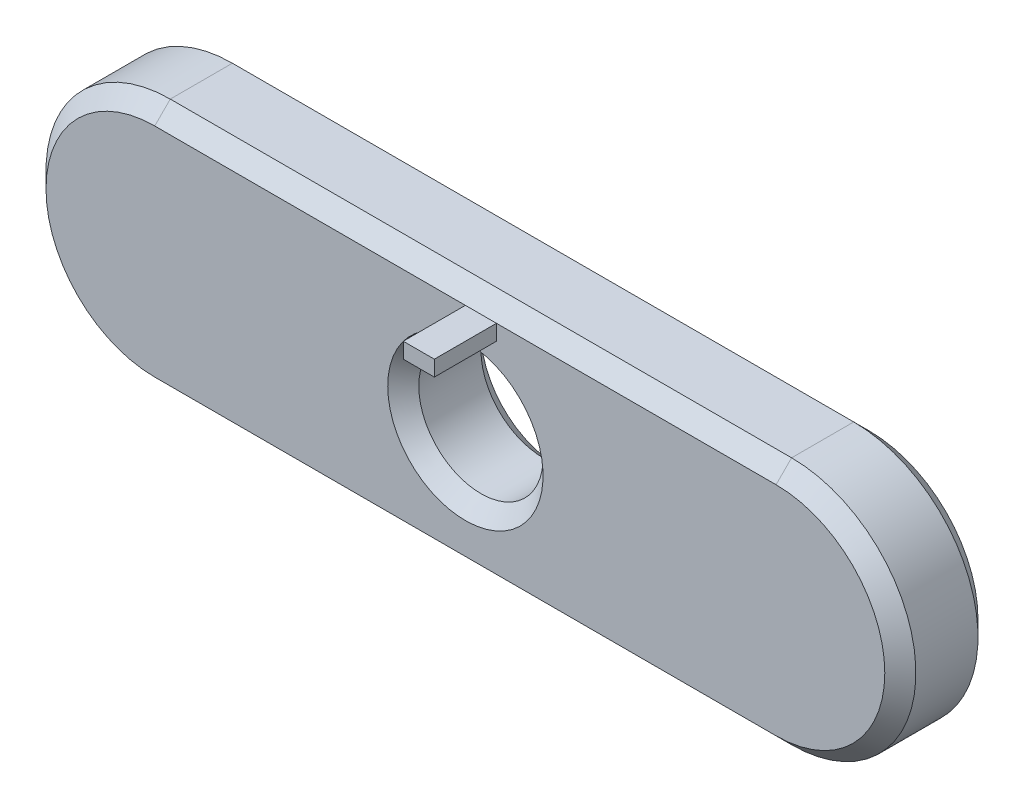
ISO-10303-21;
HEADER;
FILE_DESCRIPTION(('STEP AP214'),'2;1');
FILE_NAME('part.step','',(''),(''),'','','');
FILE_SCHEMA(('AUTOMOTIVE_DESIGN { 1 0 10303 214 1 1 1 1 }'));
ENDSEC;
DATA;
#1=APPLICATION_CONTEXT('core data for automotive mechanical design processes');
#2=APPLICATION_PROTOCOL_DEFINITION('international standard','automotive_design',2000,#1);
#3=PRODUCT_CONTEXT('',#1,'mechanical');
#4=PRODUCT('Part','Part','',(#3));
#5=PRODUCT_RELATED_PRODUCT_CATEGORY('part','',(#4));
#6=PRODUCT_DEFINITION_FORMATION('','',#4);
#7=PRODUCT_DEFINITION_CONTEXT('part definition',#1,'design');
#8=PRODUCT_DEFINITION('design','',#6,#7);
#9=PRODUCT_DEFINITION_SHAPE('','',#8);
#10=(LENGTH_UNIT() NAMED_UNIT(*) SI_UNIT(.MILLI.,.METRE.));
#11=(NAMED_UNIT(*) PLANE_ANGLE_UNIT() SI_UNIT($,.RADIAN.));
#12=(NAMED_UNIT(*) SI_UNIT($,.STERADIAN.) SOLID_ANGLE_UNIT());
#13=UNCERTAINTY_MEASURE_WITH_UNIT(LENGTH_MEASURE(1.E-05),#10,'distance_accuracy_value','');
#14=(GEOMETRIC_REPRESENTATION_CONTEXT(3) GLOBAL_UNCERTAINTY_ASSIGNED_CONTEXT((#13)) GLOBAL_UNIT_ASSIGNED_CONTEXT((#10,
#11,#12)) REPRESENTATION_CONTEXT('',''));
#15=CARTESIAN_POINT('',(0.,0.,0.));
#16=DIRECTION('',(0.,0.,1.));
#17=DIRECTION('',(1.,0.,0.));
#18=AXIS2_PLACEMENT_3D('',#15,#16,#17);
#19=CARTESIAN_POINT('',(10.,0.,3.));
#20=DIRECTION('',(0.,0.,-1.));
#21=DIRECTION('',(-1.,0.,0.));
#22=AXIS2_PLACEMENT_3D('',#19,#20,#21);
#23=PLANE('',#22);
#24=CARTESIAN_POINT('',(0.,0.,3.));
#25=DIRECTION('',(0.,0.,-1.));
#26=DIRECTION('',(-1.,0.,0.));
#27=AXIS2_PLACEMENT_3D('',#24,#25,#26);
#28=CIRCLE('',#27,2.5);
#29=CARTESIAN_POINT('',(-2.5,0.,3.));
#30=VERTEX_POINT('',#29);
#31=EDGE_CURVE('E183',#30,#30,#28,.T.);
#32=ORIENTED_EDGE('',*,*,#31,.T.);
#33=EDGE_LOOP('',(#32));
#34=FACE_BOUND('',#33,.T.);
#35=DIRECTION('',(0.,-1.,0.));
#36=VECTOR('',#35,1.);
#37=CARTESIAN_POINT('',(0.,0.,3.));
#38=LINE('',#37,#36);
#39=CARTESIAN_POINT('',(0.,3.49999999999997,3.00000000000002));
#40=VERTEX_POINT('',#39);
#41=CARTESIAN_POINT('',(0.,3.,3.));
#42=VERTEX_POINT('',#41);
#43=EDGE_CURVE('E147',#40,#42,#38,.T.);
#44=ORIENTED_EDGE('',*,*,#43,.F.);
#45=DIRECTION('',(-1.,0.,0.));
#46=VECTOR('',#45,1.);
#47=CARTESIAN_POINT('',(-10.,3.5,3.));
#48=LINE('',#47,#46);
#49=CARTESIAN_POINT('',(-10.,3.5,3.));
#50=VERTEX_POINT('',#49);
#51=EDGE_CURVE('E196',#40,#50,#48,.T.);
#52=ORIENTED_EDGE('',*,*,#51,.T.);
#53=CARTESIAN_POINT('',(-10.,0.,3.));
#54=DIRECTION('',(0.,0.,-1.));
#55=DIRECTION('',(-1.,0.,0.));
#56=AXIS2_PLACEMENT_3D('',#53,#54,#55);
#57=CIRCLE('',#56,3.49999999999999);
#58=CARTESIAN_POINT('',(-10.,-3.49999999999999,3.));
#59=VERTEX_POINT('',#58);
#60=EDGE_CURVE('E199',#50,#59,#57,.F.);
#61=ORIENTED_EDGE('',*,*,#60,.T.);
#62=DIRECTION('',(1.,0.,0.));
#63=VECTOR('',#62,1.);
#64=CARTESIAN_POINT('',(10.,-3.49999999999999,3.));
#65=LINE('',#64,#63);
#66=CARTESIAN_POINT('',(10.,-3.5,3.));
#67=VERTEX_POINT('',#66);
#68=EDGE_CURVE('E201',#59,#67,#65,.T.);
#69=ORIENTED_EDGE('',*,*,#68,.T.);
#70=CARTESIAN_POINT('',(10.,0.,3.));
#71=DIRECTION('',(0.,0.,-1.));
#72=DIRECTION('',(-1.,0.,0.));
#73=AXIS2_PLACEMENT_3D('',#70,#71,#72);
#74=CIRCLE('',#73,3.5);
#75=CARTESIAN_POINT('',(10.,3.5,3.));
#76=VERTEX_POINT('',#75);
#77=EDGE_CURVE('E194',#67,#76,#74,.F.);
#78=ORIENTED_EDGE('',*,*,#77,.T.);
#79=CARTESIAN_POINT('',(1.,3.5,3.));
#80=VERTEX_POINT('',#79);
#81=EDGE_CURVE('E197',#76,#80,#48,.T.);
#82=ORIENTED_EDGE('',*,*,#81,.T.);
#83=DIRECTION('',(0.,1.,0.));
#84=VECTOR('',#83,1.);
#85=CARTESIAN_POINT('',(1.,0.,3.));
#86=LINE('',#85,#84);
#87=CARTESIAN_POINT('',(1.,3.,3.));
#88=VERTEX_POINT('',#87);
#89=EDGE_CURVE('E56',#88,#80,#86,.T.);
#90=ORIENTED_EDGE('',*,*,#89,.F.);
#91=DIRECTION('',(1.,0.,0.));
#92=VECTOR('',#91,1.);
#93=CARTESIAN_POINT('',(10.,3.,3.));
#94=LINE('',#93,#92);
#95=EDGE_CURVE('E51',#42,#88,#94,.T.);
#96=ORIENTED_EDGE('',*,*,#95,.F.);
#97=EDGE_LOOP('',(#44,#52,#61,#69,#78,#82,#90,#96));
#98=FACE_BOUND('',#97,.T.);
#99=ADVANCED_FACE('F36',(#34,#98),#23,.F.);
#100=CARTESIAN_POINT('',(10.,0.,3.));
#101=DIRECTION('',(0.,0.,-1.));
#102=DIRECTION('',(-1.,0.,0.));
#103=AXIS2_PLACEMENT_3D('',#100,#101,#102);
#104=CYLINDRICAL_SURFACE('',#103,4.);
#105=DIRECTION('',(0.,0.,-1.));
#106=VECTOR('',#105,1.);
#107=CARTESIAN_POINT('',(10.,4.,3.));
#108=LINE('',#107,#106);
#109=CARTESIAN_POINT('',(10.,4.,2.49999999999999));
#110=VERTEX_POINT('',#109);
#111=CARTESIAN_POINT('',(10.,4.,0.500000000000003));
#112=VERTEX_POINT('',#111);
#113=EDGE_CURVE('E180',#110,#112,#108,.T.);
#114=ORIENTED_EDGE('',*,*,#113,.F.);
#115=CARTESIAN_POINT('',(10.,0.,2.49999999999999));
#116=DIRECTION('',(0.,0.,-1.));
#117=DIRECTION('',(-1.,0.,0.));
#118=AXIS2_PLACEMENT_3D('',#115,#116,#117);
#119=CIRCLE('',#118,4.);
#120=CARTESIAN_POINT('',(10.,-4.,2.49999999999999));
#121=VERTEX_POINT('',#120);
#122=EDGE_CURVE('E220',#110,#121,#119,.T.);
#123=ORIENTED_EDGE('',*,*,#122,.T.);
#124=DIRECTION('',(0.,0.,-1.));
#125=VECTOR('',#124,1.);
#126=CARTESIAN_POINT('',(10.,-4.,3.));
#127=LINE('',#126,#125);
#128=CARTESIAN_POINT('',(10.,-4.,0.500000000000003));
#129=VERTEX_POINT('',#128);
#130=EDGE_CURVE('E179',#121,#129,#127,.T.);
#131=ORIENTED_EDGE('',*,*,#130,.T.);
#132=CARTESIAN_POINT('',(10.,0.,0.500000000000003));
#133=DIRECTION('',(0.,0.,-1.));
#134=DIRECTION('',(-1.,0.,0.));
#135=AXIS2_PLACEMENT_3D('',#132,#133,#134);
#136=CIRCLE('',#135,4.);
#137=EDGE_CURVE('E218',#129,#112,#136,.F.);
#138=ORIENTED_EDGE('',*,*,#137,.T.);
#139=EDGE_LOOP('',(#114,#123,#131,#138));
#140=FACE_BOUND('',#139,.T.);
#141=ADVANCED_FACE('F38',(#140),#104,.T.);
#142=CARTESIAN_POINT('',(-10.,4.,3.));
#143=DIRECTION('',(0.,1.,0.));
#144=DIRECTION('',(0.,0.,1.));
#145=AXIS2_PLACEMENT_3D('',#142,#143,#144);
#146=PLANE('',#145);
#147=DIRECTION('',(0.,0.,-1.));
#148=VECTOR('',#147,1.);
#149=CARTESIAN_POINT('',(-10.,4.,3.));
#150=LINE('',#149,#148);
#151=CARTESIAN_POINT('',(-10.,4.,2.49999999999999));
#152=VERTEX_POINT('',#151);
#153=CARTESIAN_POINT('',(-10.,4.,0.500000000000009));
#154=VERTEX_POINT('',#153);
#155=EDGE_CURVE('E184',#152,#154,#150,.T.);
#156=ORIENTED_EDGE('',*,*,#155,.F.);
#157=DIRECTION('',(1.,0.,0.));
#158=VECTOR('',#157,1.);
#159=CARTESIAN_POINT('',(10.,4.,2.49999999999999));
#160=LINE('',#159,#158);
#161=EDGE_CURVE('E216',#152,#110,#160,.T.);
#162=ORIENTED_EDGE('',*,*,#161,.T.);
#163=ORIENTED_EDGE('',*,*,#113,.T.);
#164=DIRECTION('',(-1.,0.,0.));
#165=VECTOR('',#164,1.);
#166=CARTESIAN_POINT('',(-10.,4.,0.500000000000003));
#167=LINE('',#166,#165);
#168=EDGE_CURVE('E213',#112,#154,#167,.T.);
#169=ORIENTED_EDGE('',*,*,#168,.T.);
#170=EDGE_LOOP('',(#156,#162,#163,#169));
#171=FACE_BOUND('',#170,.T.);
#172=ADVANCED_FACE('F280',(#171),#146,.T.);
#173=CARTESIAN_POINT('',(-10.,0.,3.));
#174=DIRECTION('',(0.,0.,-1.));
#175=DIRECTION('',(-1.,0.,0.));
#176=AXIS2_PLACEMENT_3D('',#173,#174,#175);
#177=CYLINDRICAL_SURFACE('',#176,4.);
#178=DIRECTION('',(0.,0.,-1.));
#179=VECTOR('',#178,1.);
#180=CARTESIAN_POINT('',(-10.,-4.,3.));
#181=LINE('',#180,#179);
#182=CARTESIAN_POINT('',(-10.,-4.,2.5));
#183=VERTEX_POINT('',#182);
#184=CARTESIAN_POINT('',(-10.,-4.,0.500000000000009));
#185=VERTEX_POINT('',#184);
#186=EDGE_CURVE('E187',#183,#185,#181,.T.);
#187=ORIENTED_EDGE('',*,*,#186,.F.);
#188=CARTESIAN_POINT('',(-10.,0.,2.5));
#189=DIRECTION('',(0.,0.,-1.));
#190=DIRECTION('',(-1.,0.,0.));
#191=AXIS2_PLACEMENT_3D('',#188,#189,#190);
#192=CIRCLE('',#191,4.);
#193=EDGE_CURVE('E211',#183,#152,#192,.T.);
#194=ORIENTED_EDGE('',*,*,#193,.T.);
#195=ORIENTED_EDGE('',*,*,#155,.T.);
#196=CARTESIAN_POINT('',(-10.,0.,0.500000000000009));
#197=DIRECTION('',(0.,0.,-1.));
#198=DIRECTION('',(-1.,0.,0.));
#199=AXIS2_PLACEMENT_3D('',#196,#197,#198);
#200=CIRCLE('',#199,4.);
#201=EDGE_CURVE('E209',#154,#185,#200,.F.);
#202=ORIENTED_EDGE('',*,*,#201,.T.);
#203=EDGE_LOOP('',(#187,#194,#195,#202));
#204=FACE_BOUND('',#203,.T.);
#205=ADVANCED_FACE('F276',(#204),#177,.T.);
#206=CARTESIAN_POINT('',(-10.,-4.,3.));
#207=DIRECTION('',(0.,1.,0.));
#208=DIRECTION('',(-1.,0.,0.));
#209=AXIS2_PLACEMENT_3D('',#206,#207,#208);
#210=PLANE('',#209);
#211=ORIENTED_EDGE('',*,*,#130,.F.);
#212=DIRECTION('',(-1.,0.,0.));
#213=VECTOR('',#212,1.);
#214=CARTESIAN_POINT('',(-10.,-4.,2.5));
#215=LINE('',#214,#213);
#216=EDGE_CURVE('E206',#121,#183,#215,.T.);
#217=ORIENTED_EDGE('',*,*,#216,.T.);
#218=ORIENTED_EDGE('',*,*,#186,.T.);
#219=DIRECTION('',(1.,0.,0.));
#220=VECTOR('',#219,1.);
#221=CARTESIAN_POINT('',(10.,-4.,0.500000000000009));
#222=LINE('',#221,#220);
#223=EDGE_CURVE('E204',#185,#129,#222,.T.);
#224=ORIENTED_EDGE('',*,*,#223,.T.);
#225=EDGE_LOOP('',(#211,#217,#218,#224));
#226=FACE_BOUND('',#225,.T.);
#227=ADVANCED_FACE('F259',(#226),#210,.F.);
#228=CARTESIAN_POINT('',(10.,0.,0.));
#229=DIRECTION('',(0.,0.,-1.));
#230=DIRECTION('',(-1.,0.,0.));
#231=AXIS2_PLACEMENT_3D('',#228,#229,#230);
#232=PLANE('',#231);
#233=DIRECTION('',(1.,0.,0.));
#234=VECTOR('',#233,1.);
#235=CARTESIAN_POINT('',(10.,3.49999999999999,0.));
#236=LINE('',#235,#234);
#237=CARTESIAN_POINT('',(-10.,3.5,0.));
#238=VERTEX_POINT('',#237);
#239=CARTESIAN_POINT('',(10.,3.49999999999999,0.));
#240=VERTEX_POINT('',#239);
#241=EDGE_CURVE('E11',#238,#240,#236,.T.);
#242=ORIENTED_EDGE('',*,*,#241,.T.);
#243=CARTESIAN_POINT('',(10.,0.,0.));
#244=DIRECTION('',(0.,0.,-1.));
#245=DIRECTION('',(-1.,0.,0.));
#246=AXIS2_PLACEMENT_3D('',#243,#244,#245);
#247=CIRCLE('',#246,3.49999999999999);
#248=CARTESIAN_POINT('',(10.,-3.49999999999999,0.));
#249=VERTEX_POINT('',#248);
#250=EDGE_CURVE('E231',#240,#249,#247,.T.);
#251=ORIENTED_EDGE('',*,*,#250,.T.);
#252=DIRECTION('',(-1.,0.,0.));
#253=VECTOR('',#252,1.);
#254=CARTESIAN_POINT('',(-10.,-3.5,0.));
#255=LINE('',#254,#253);
#256=CARTESIAN_POINT('',(-10.,-3.5,0.));
#257=VERTEX_POINT('',#256);
#258=EDGE_CURVE('E233',#249,#257,#255,.T.);
#259=ORIENTED_EDGE('',*,*,#258,.T.);
#260=CARTESIAN_POINT('',(-10.,0.,0.));
#261=DIRECTION('',(0.,0.,-1.));
#262=DIRECTION('',(-1.,0.,0.));
#263=AXIS2_PLACEMENT_3D('',#260,#261,#262);
#264=CIRCLE('',#263,3.5);
#265=EDGE_CURVE('E44',#257,#238,#264,.T.);
#266=ORIENTED_EDGE('',*,*,#265,.T.);
#267=EDGE_LOOP('',(#242,#251,#259,#266));
#268=FACE_BOUND('',#267,.T.);
#269=CARTESIAN_POINT('',(0.,0.,0.));
#270=DIRECTION('',(0.,0.,-1.));
#271=DIRECTION('',(-1.,0.,0.));
#272=AXIS2_PLACEMENT_3D('',#269,#270,#271);
#273=CIRCLE('',#272,2.50000000000001);
#274=CARTESIAN_POINT('',(-2.50000000000001,0.,0.));
#275=VERTEX_POINT('',#274);
#276=EDGE_CURVE('E228',#275,#275,#273,.F.);
#277=ORIENTED_EDGE('',*,*,#276,.T.);
#278=EDGE_LOOP('',(#277));
#279=FACE_BOUND('',#278,.T.);
#280=ADVANCED_FACE('F237',(#268,#279),#232,.T.);
#281=CARTESIAN_POINT('',(0.,0.,0.));
#282=DIRECTION('',(0.,0.,1.));
#283=DIRECTION('',(1.,0.,0.));
#284=AXIS2_PLACEMENT_3D('',#281,#282,#283);
#285=CYLINDRICAL_SURFACE('',#284,2.);
#286=CARTESIAN_POINT('',(0.,0.,2.49999999999999));
#287=DIRECTION('',(0.,0.,-1.));
#288=DIRECTION('',(-1.,0.,0.));
#289=AXIS2_PLACEMENT_3D('',#286,#287,#288);
#290=CIRCLE('',#289,2.);
#291=CARTESIAN_POINT('',(-2.,0.,2.49999999999999));
#292=VERTEX_POINT('',#291);
#293=EDGE_CURVE('E225',#292,#292,#290,.F.);
#294=ORIENTED_EDGE('',*,*,#293,.T.);
#295=EDGE_LOOP('',(#294));
#296=FACE_BOUND('',#295,.T.);
#297=CARTESIAN_POINT('',(0.,0.,0.500000000000004));
#298=DIRECTION('',(0.,0.,-1.));
#299=DIRECTION('',(-1.,0.,0.));
#300=AXIS2_PLACEMENT_3D('',#297,#298,#299);
#301=CIRCLE('',#300,2.);
#302=CARTESIAN_POINT('',(-2.,0.,0.500000000000004));
#303=VERTEX_POINT('',#302);
#304=EDGE_CURVE('E222',#303,#303,#301,.T.);
#305=ORIENTED_EDGE('',*,*,#304,.T.);
#306=EDGE_LOOP('',(#305));
#307=FACE_BOUND('',#306,.T.);
#308=ADVANCED_FACE('F323',(#296,#307),#285,.F.);
#309=CARTESIAN_POINT('',(-10.,4.,2.49999999999999));
#310=DIRECTION('',(0.,0.707106781186551,0.707106781186544));
#311=DIRECTION('',(0.,-0.707106781186544,0.707106781186551));
#312=AXIS2_PLACEMENT_3D('',#309,#310,#311);
#313=PLANE('',#312);
#314=DIRECTION('',(0.,-0.707106781186544,0.707106781186551));
#315=VECTOR('',#314,1.);
#316=CARTESIAN_POINT('',(10.,4.,2.49999999999999));
#317=LINE('',#316,#315);
#318=EDGE_CURVE('E173',#110,#76,#317,.T.);
#319=ORIENTED_EDGE('',*,*,#318,.F.);
#320=ORIENTED_EDGE('',*,*,#161,.F.);
#321=DIRECTION('',(0.,0.707106781186544,-0.707106781186551));
#322=VECTOR('',#321,1.);
#323=CARTESIAN_POINT('',(-10.,3.5,3.));
#324=LINE('',#323,#322);
#325=EDGE_CURVE('E176',#50,#152,#324,.T.);
#326=ORIENTED_EDGE('',*,*,#325,.F.);
#327=ORIENTED_EDGE('',*,*,#51,.F.);
#328=DIRECTION('',(1.,0.,0.));
#329=VECTOR('',#328,1.);
#330=CARTESIAN_POINT('',(-10.,3.49999999999997,3.00000000000002));
#331=LINE('',#330,#329);
#332=EDGE_CURVE('E148',#40,#80,#331,.T.);
#333=ORIENTED_EDGE('',*,*,#332,.T.);
#334=ORIENTED_EDGE('',*,*,#81,.F.);
#335=EDGE_LOOP('',(#319,#320,#326,#327,#333,#334));
#336=FACE_BOUND('',#335,.T.);
#337=ADVANCED_FACE('F283',(#336),#313,.T.);
#338=CARTESIAN_POINT('',(-10.,0.,3.));
#339=DIRECTION('',(0.,0.,-1.));
#340=DIRECTION('',(-1.,0.,0.));
#341=AXIS2_PLACEMENT_3D('',#338,#339,#340);
#342=CONICAL_SURFACE('',#341,3.49999999999999,0.785398163397453);
#343=ORIENTED_EDGE('',*,*,#325,.T.);
#344=ORIENTED_EDGE('',*,*,#193,.F.);
#345=DIRECTION('',(0.,-0.707106781186551,-0.707106781186544));
#346=VECTOR('',#345,1.);
#347=CARTESIAN_POINT('',(-10.,-3.49999999999999,3.));
#348=LINE('',#347,#346);
#349=EDGE_CURVE('E171',#59,#183,#348,.T.);
#350=ORIENTED_EDGE('',*,*,#349,.F.);
#351=ORIENTED_EDGE('',*,*,#60,.F.);
#352=EDGE_LOOP('',(#343,#344,#350,#351));
#353=FACE_BOUND('',#352,.T.);
#354=ADVANCED_FACE('F287',(#353),#342,.T.);
#355=CARTESIAN_POINT('',(10.,0.,2.49999999999999));
#356=DIRECTION('',(0.,0.,-1.));
#357=DIRECTION('',(-1.,0.,0.));
#358=AXIS2_PLACEMENT_3D('',#355,#356,#357);
#359=CONICAL_SURFACE('',#358,4.,0.785398163397443);
#360=ORIENTED_EDGE('',*,*,#318,.T.);
#361=ORIENTED_EDGE('',*,*,#77,.F.);
#362=DIRECTION('',(0.,0.707106781186544,0.707106781186551));
#363=VECTOR('',#362,1.);
#364=CARTESIAN_POINT('',(10.,-4.,2.49999999999999));
#365=LINE('',#364,#363);
#366=EDGE_CURVE('E169',#121,#67,#365,.T.);
#367=ORIENTED_EDGE('',*,*,#366,.F.);
#368=ORIENTED_EDGE('',*,*,#122,.F.);
#369=EDGE_LOOP('',(#360,#361,#367,#368));
#370=FACE_BOUND('',#369,.T.);
#371=ADVANCED_FACE('F268',(#370),#359,.T.);
#372=CARTESIAN_POINT('',(10.,-3.49999999999999,3.));
#373=DIRECTION('',(0.,0.707106781186544,-0.707106781186551));
#374=DIRECTION('',(0.,0.707106781186551,0.707106781186544));
#375=AXIS2_PLACEMENT_3D('',#372,#373,#374);
#376=PLANE('',#375);
#377=ORIENTED_EDGE('',*,*,#349,.T.);
#378=ORIENTED_EDGE('',*,*,#216,.F.);
#379=ORIENTED_EDGE('',*,*,#366,.T.);
#380=ORIENTED_EDGE('',*,*,#68,.F.);
#381=EDGE_LOOP('',(#377,#378,#379,#380));
#382=FACE_BOUND('',#381,.T.);
#383=ADVANCED_FACE('F272',(#382),#376,.F.);
#384=CARTESIAN_POINT('',(0.,0.,2.49999999999999));
#385=DIRECTION('',(0.,0.,1.));
#386=DIRECTION('',(1.,0.,0.));
#387=AXIS2_PLACEMENT_3D('',#384,#385,#386);
#388=CONICAL_SURFACE('',#387,2.,0.785398163397443);
#389=ORIENTED_EDGE('',*,*,#31,.F.);
#390=EDGE_LOOP('',(#389));
#391=FACE_BOUND('',#390,.T.);
#392=ORIENTED_EDGE('',*,*,#293,.F.);
#393=EDGE_LOOP('',(#392));
#394=FACE_BOUND('',#393,.T.);
#395=ADVANCED_FACE('F340',(#391,#394),#388,.F.);
#396=CARTESIAN_POINT('',(-10.,-4.,0.500000000000009));
#397=DIRECTION('',(0.,-0.707106781186551,-0.707106781186544));
#398=DIRECTION('',(0.,0.707106781186544,-0.707106781186551));
#399=AXIS2_PLACEMENT_3D('',#396,#397,#398);
#400=PLANE('',#399);
#401=DIRECTION('',(0.,0.707106781186544,-0.707106781186551));
#402=VECTOR('',#401,1.);
#403=CARTESIAN_POINT('',(10.,-4.,0.500000000000009));
#404=LINE('',#403,#402);
#405=EDGE_CURVE('E163',#129,#249,#404,.T.);
#406=ORIENTED_EDGE('',*,*,#405,.F.);
#407=ORIENTED_EDGE('',*,*,#223,.F.);
#408=DIRECTION('',(0.,-0.707106781186544,0.707106781186551));
#409=VECTOR('',#408,1.);
#410=CARTESIAN_POINT('',(-10.,-3.5,0.));
#411=LINE('',#410,#409);
#412=EDGE_CURVE('E166',#257,#185,#411,.T.);
#413=ORIENTED_EDGE('',*,*,#412,.F.);
#414=ORIENTED_EDGE('',*,*,#258,.F.);
#415=EDGE_LOOP('',(#406,#407,#413,#414));
#416=FACE_BOUND('',#415,.T.);
#417=ADVANCED_FACE('F255',(#416),#400,.T.);
#418=CARTESIAN_POINT('',(-10.,0.,0.500000000000009));
#419=DIRECTION('',(0.,0.,1.));
#420=DIRECTION('',(1.,0.,0.));
#421=AXIS2_PLACEMENT_3D('',#418,#419,#420);
#422=CONICAL_SURFACE('',#421,4.,0.785398163397443);
#423=ORIENTED_EDGE('',*,*,#412,.T.);
#424=ORIENTED_EDGE('',*,*,#201,.F.);
#425=DIRECTION('',(0.,0.707106781186544,0.707106781186551));
#426=VECTOR('',#425,1.);
#427=CARTESIAN_POINT('',(-10.,3.5,0.));
#428=LINE('',#427,#426);
#429=EDGE_CURVE('E161',#238,#154,#428,.T.);
#430=ORIENTED_EDGE('',*,*,#429,.F.);
#431=ORIENTED_EDGE('',*,*,#265,.F.);
#432=EDGE_LOOP('',(#423,#424,#430,#431));
#433=FACE_BOUND('',#432,.T.);
#434=ADVANCED_FACE('F244',(#433),#422,.T.);
#435=CARTESIAN_POINT('',(10.,0.,0.));
#436=DIRECTION('',(0.,0.,1.));
#437=DIRECTION('',(1.,0.,0.));
#438=AXIS2_PLACEMENT_3D('',#435,#436,#437);
#439=CONICAL_SURFACE('',#438,3.49999999999999,0.785398163397453);
#440=ORIENTED_EDGE('',*,*,#405,.T.);
#441=ORIENTED_EDGE('',*,*,#250,.F.);
#442=DIRECTION('',(0.,-0.707106781186551,-0.707106781186544));
#443=VECTOR('',#442,1.);
#444=CARTESIAN_POINT('',(10.,4.,0.500000000000003));
#445=LINE('',#444,#443);
#446=EDGE_CURVE('E158',#112,#240,#445,.T.);
#447=ORIENTED_EDGE('',*,*,#446,.F.);
#448=ORIENTED_EDGE('',*,*,#137,.F.);
#449=EDGE_LOOP('',(#440,#441,#447,#448));
#450=FACE_BOUND('',#449,.T.);
#451=ADVANCED_FACE('F252',(#450),#439,.T.);
#452=CARTESIAN_POINT('',(10.,3.49999999999999,0.));
#453=DIRECTION('',(0.,-0.707106781186544,0.707106781186551));
#454=DIRECTION('',(0.,-0.707106781186551,-0.707106781186544));
#455=AXIS2_PLACEMENT_3D('',#452,#453,#454);
#456=PLANE('',#455);
#457=ORIENTED_EDGE('',*,*,#429,.T.);
#458=ORIENTED_EDGE('',*,*,#168,.F.);
#459=ORIENTED_EDGE('',*,*,#446,.T.);
#460=ORIENTED_EDGE('',*,*,#241,.F.);
#461=EDGE_LOOP('',(#457,#458,#459,#460));
#462=FACE_BOUND('',#461,.T.);
#463=ADVANCED_FACE('F247',(#462),#456,.F.);
#464=CARTESIAN_POINT('',(0.,0.,0.));
#465=DIRECTION('',(0.,0.,-1.));
#466=DIRECTION('',(-1.,0.,0.));
#467=AXIS2_PLACEMENT_3D('',#464,#465,#466);
#468=CONICAL_SURFACE('',#467,2.50000000000001,0.785398163397453);
#469=ORIENTED_EDGE('',*,*,#304,.F.);
#470=EDGE_LOOP('',(#469));
#471=FACE_BOUND('',#470,.T.);
#472=ORIENTED_EDGE('',*,*,#276,.F.);
#473=EDGE_LOOP('',(#472));
#474=FACE_BOUND('',#473,.T.);
#475=ADVANCED_FACE('F352',(#471,#474),#468,.F.);
#476=CARTESIAN_POINT('',(0.,3.49999999999997,5.));
#477=DIRECTION('',(1.,0.,0.));
#478=DIRECTION('',(0.,0.,-1.));
#479=AXIS2_PLACEMENT_3D('',#476,#477,#478);
#480=PLANE('',#479);
#481=DIRECTION('',(0.,0.,-1.));
#482=VECTOR('',#481,1.);
#483=CARTESIAN_POINT('',(0.,3.49999999999997,5.));
#484=LINE('',#483,#482);
#485=CARTESIAN_POINT('',(0.,3.49999999999997,5.));
#486=VERTEX_POINT('',#485);
#487=EDGE_CURVE('E295',#486,#40,#484,.T.);
#488=ORIENTED_EDGE('',*,*,#487,.T.);
#489=ORIENTED_EDGE('',*,*,#43,.T.);
#490=DIRECTION('',(0.,0.,-1.));
#491=VECTOR('',#490,1.);
#492=CARTESIAN_POINT('',(0.,3.,5.));
#493=LINE('',#492,#491);
#494=CARTESIAN_POINT('',(0.,3.,5.));
#495=VERTEX_POINT('',#494);
#496=EDGE_CURVE('E130',#495,#42,#493,.T.);
#497=ORIENTED_EDGE('',*,*,#496,.F.);
#498=DIRECTION('',(0.,-1.,0.));
#499=VECTOR('',#498,1.);
#500=CARTESIAN_POINT('',(0.,3.49999999999997,5.));
#501=LINE('',#500,#499);
#502=EDGE_CURVE('E136',#486,#495,#501,.T.);
#503=ORIENTED_EDGE('',*,*,#502,.F.);
#504=EDGE_LOOP('',(#488,#489,#497,#503));
#505=FACE_BOUND('',#504,.T.);
#506=ADVANCED_FACE('F146',(#505),#480,.F.);
#507=CARTESIAN_POINT('',(0.,3.,5.));
#508=DIRECTION('',(0.,1.,0.));
#509=DIRECTION('',(0.,0.,1.));
#510=AXIS2_PLACEMENT_3D('',#507,#508,#509);
#511=PLANE('',#510);
#512=ORIENTED_EDGE('',*,*,#496,.T.);
#513=ORIENTED_EDGE('',*,*,#95,.T.);
#514=DIRECTION('',(0.,0.,-1.));
#515=VECTOR('',#514,1.);
#516=CARTESIAN_POINT('',(1.,3.,5.));
#517=LINE('',#516,#515);
#518=CARTESIAN_POINT('',(1.,3.,5.));
#519=VERTEX_POINT('',#518);
#520=EDGE_CURVE('E132',#519,#88,#517,.T.);
#521=ORIENTED_EDGE('',*,*,#520,.F.);
#522=DIRECTION('',(1.,0.,0.));
#523=VECTOR('',#522,1.);
#524=CARTESIAN_POINT('',(0.,3.,5.));
#525=LINE('',#524,#523);
#526=EDGE_CURVE('E126',#495,#519,#525,.T.);
#527=ORIENTED_EDGE('',*,*,#526,.F.);
#528=EDGE_LOOP('',(#512,#513,#521,#527));
#529=FACE_BOUND('',#528,.T.);
#530=ADVANCED_FACE('F128',(#529),#511,.F.);
#531=CARTESIAN_POINT('',(1.,3.49999999999997,5.));
#532=DIRECTION('',(-1.,0.,0.));
#533=DIRECTION('',(0.,0.,1.));
#534=AXIS2_PLACEMENT_3D('',#531,#532,#533);
#535=PLANE('',#534);
#536=ORIENTED_EDGE('',*,*,#520,.T.);
#537=ORIENTED_EDGE('',*,*,#89,.T.);
#538=DIRECTION('',(0.,0.,-1.));
#539=VECTOR('',#538,1.);
#540=CARTESIAN_POINT('',(1.,3.49999999999997,5.));
#541=LINE('',#540,#539);
#542=CARTESIAN_POINT('',(1.,3.49999999999997,5.));
#543=VERTEX_POINT('',#542);
#544=EDGE_CURVE('E151',#543,#80,#541,.T.);
#545=ORIENTED_EDGE('',*,*,#544,.F.);
#546=DIRECTION('',(0.,1.,0.));
#547=VECTOR('',#546,1.);
#548=CARTESIAN_POINT('',(1.,3.49999999999997,5.));
#549=LINE('',#548,#547);
#550=EDGE_CURVE('E135',#519,#543,#549,.T.);
#551=ORIENTED_EDGE('',*,*,#550,.F.);
#552=EDGE_LOOP('',(#536,#537,#545,#551));
#553=FACE_BOUND('',#552,.T.);
#554=ADVANCED_FACE('F293',(#553),#535,.F.);
#555=CARTESIAN_POINT('',(0.,3.49999999999997,5.));
#556=DIRECTION('',(0.,-1.,0.));
#557=DIRECTION('',(0.,0.,-1.));
#558=AXIS2_PLACEMENT_3D('',#555,#556,#557);
#559=PLANE('',#558);
#560=ORIENTED_EDGE('',*,*,#332,.F.);
#561=ORIENTED_EDGE('',*,*,#487,.F.);
#562=DIRECTION('',(-1.,0.,0.));
#563=VECTOR('',#562,1.);
#564=CARTESIAN_POINT('',(0.,3.49999999999997,5.));
#565=LINE('',#564,#563);
#566=EDGE_CURVE('E141',#543,#486,#565,.T.);
#567=ORIENTED_EDGE('',*,*,#566,.F.);
#568=ORIENTED_EDGE('',*,*,#544,.T.);
#569=EDGE_LOOP('',(#560,#561,#567,#568));
#570=FACE_BOUND('',#569,.T.);
#571=ADVANCED_FACE('F294',(#570),#559,.F.);
#572=CARTESIAN_POINT('',(0.,3.,5.));
#573=DIRECTION('',(0.,0.,1.));
#574=DIRECTION('',(1.,0.,0.));
#575=AXIS2_PLACEMENT_3D('',#572,#573,#574);
#576=PLANE('',#575);
#577=ORIENTED_EDGE('',*,*,#502,.T.);
#578=ORIENTED_EDGE('',*,*,#526,.T.);
#579=ORIENTED_EDGE('',*,*,#550,.T.);
#580=ORIENTED_EDGE('',*,*,#566,.T.);
#581=EDGE_LOOP('',(#577,#578,#579,#580));
#582=FACE_BOUND('',#581,.T.);
#583=ADVANCED_FACE('F139',(#582),#576,.T.);
#584=CLOSED_SHELL('',(#99,#141,#172,#205,#227,#280,#308,#337,#354,#371,#383,#395,#417,#434,#451,
#463,#475,#506,#530,#554,#571,#583));
#585=MANIFOLD_SOLID_BREP('B2',#584);
#586=ADVANCED_BREP_SHAPE_REPRESENTATION('',(#18,#585),#14);
#587=SHAPE_DEFINITION_REPRESENTATION(#9,#586);
ENDSEC;
END-ISO-10303-21;
